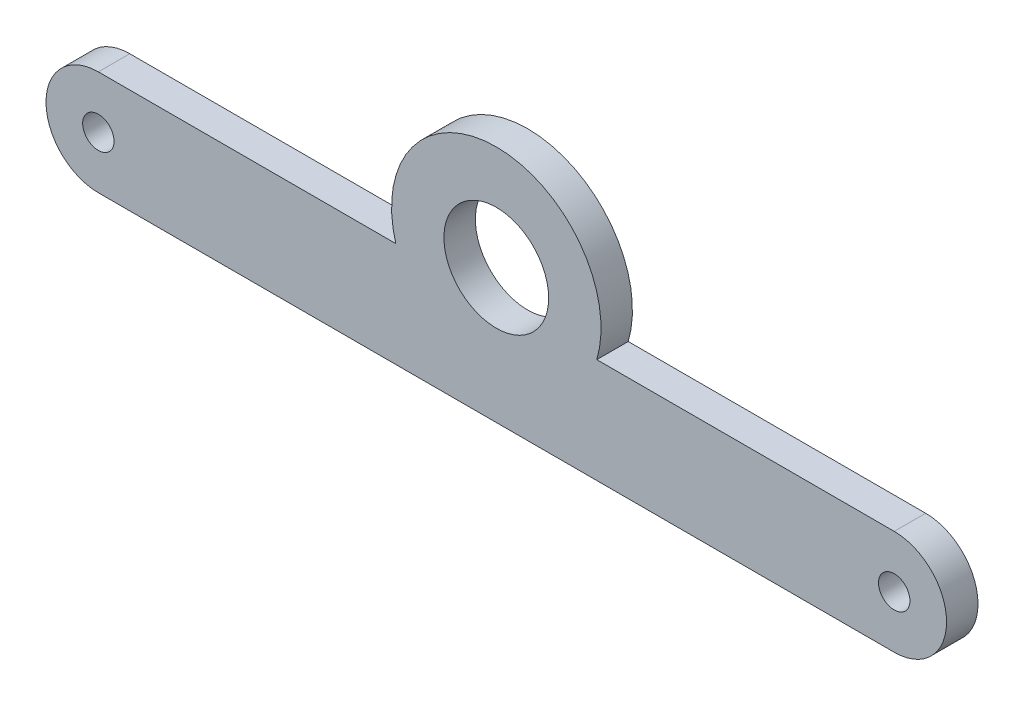
ISO-10303-21;
HEADER;
FILE_DESCRIPTION(('STEP AP214'),'2;1');
FILE_NAME('part.step','',(''),(''),'','','');
FILE_SCHEMA(('AUTOMOTIVE_DESIGN { 1 0 10303 214 1 1 1 1 }'));
ENDSEC;
DATA;
#1=APPLICATION_CONTEXT('core data for automotive mechanical design processes');
#2=APPLICATION_PROTOCOL_DEFINITION('international standard','automotive_design',2000,#1);
#3=PRODUCT_CONTEXT('',#1,'mechanical');
#4=PRODUCT('Part','Part','',(#3));
#5=PRODUCT_RELATED_PRODUCT_CATEGORY('part','',(#4));
#6=PRODUCT_DEFINITION_FORMATION('','',#4);
#7=PRODUCT_DEFINITION_CONTEXT('part definition',#1,'design');
#8=PRODUCT_DEFINITION('design','',#6,#7);
#9=PRODUCT_DEFINITION_SHAPE('','',#8);
#10=(LENGTH_UNIT() NAMED_UNIT(*) SI_UNIT(.MILLI.,.METRE.));
#11=(NAMED_UNIT(*) PLANE_ANGLE_UNIT() SI_UNIT($,.RADIAN.));
#12=(NAMED_UNIT(*) SI_UNIT($,.STERADIAN.) SOLID_ANGLE_UNIT());
#13=UNCERTAINTY_MEASURE_WITH_UNIT(LENGTH_MEASURE(1.E-05),#10,'distance_accuracy_value','');
#14=(GEOMETRIC_REPRESENTATION_CONTEXT(3) GLOBAL_UNCERTAINTY_ASSIGNED_CONTEXT((#13)) GLOBAL_UNIT_ASSIGNED_CONTEXT((#10,
#11,#12)) REPRESENTATION_CONTEXT('',''));
#15=CARTESIAN_POINT('',(0.,0.,0.));
#16=DIRECTION('',(0.,0.,1.));
#17=DIRECTION('',(1.,0.,0.));
#18=AXIS2_PLACEMENT_3D('',#15,#16,#17);
#19=CARTESIAN_POINT('',(-63.7279373587438,0.,3.));
#20=DIRECTION('',(0.,0.,1.));
#21=DIRECTION('',(1.,0.,0.));
#22=AXIS2_PLACEMENT_3D('',#19,#20,#21);
#23=PLANE('',#22);
#24=CARTESIAN_POINT('',(-63.7279373587438,0.,3.));
#25=DIRECTION('',(0.,0.,1.));
#26=DIRECTION('',(1.,0.,0.));
#27=AXIS2_PLACEMENT_3D('',#24,#25,#26);
#28=CIRCLE('',#27,1.5);
#29=CARTESIAN_POINT('',(-62.2279373587438,0.,3.));
#30=VERTEX_POINT('',#29);
#31=EDGE_CURVE('E188',#30,#30,#28,.T.);
#32=ORIENTED_EDGE('',*,*,#31,.F.);
#33=EDGE_LOOP('',(#32));
#34=FACE_BOUND('',#33,.T.);
#35=CARTESIAN_POINT('',(-63.7279373587438,0.,3.));
#36=DIRECTION('',(0.,0.,1.));
#37=DIRECTION('',(1.,0.,0.));
#38=AXIS2_PLACEMENT_3D('',#35,#36,#37);
#39=CIRCLE('',#38,5.);
#40=CARTESIAN_POINT('',(-63.7279373587438,5.,3.));
#41=VERTEX_POINT('',#40);
#42=CARTESIAN_POINT('',(-63.7279373587438,-5.,3.));
#43=VERTEX_POINT('',#42);
#44=EDGE_CURVE('E133',#41,#43,#39,.T.);
#45=ORIENTED_EDGE('',*,*,#44,.T.);
#46=DIRECTION('',(1.,0.,0.));
#47=VECTOR('',#46,1.);
#48=CARTESIAN_POINT('',(-63.7279373587438,-5.,3.));
#49=LINE('',#48,#47);
#50=CARTESIAN_POINT('',(12.2720626412562,-5.,3.));
#51=VERTEX_POINT('',#50);
#52=EDGE_CURVE('E91',#43,#51,#49,.T.);
#53=ORIENTED_EDGE('',*,*,#52,.T.);
#54=CARTESIAN_POINT('',(12.2720626412562,0.,3.));
#55=DIRECTION('',(0.,0.,1.));
#56=DIRECTION('',(1.,0.,0.));
#57=AXIS2_PLACEMENT_3D('',#54,#55,#56);
#58=CIRCLE('',#57,5.);
#59=CARTESIAN_POINT('',(12.2720626412562,5.,3.));
#60=VERTEX_POINT('',#59);
#61=EDGE_CURVE('E104',#51,#60,#58,.T.);
#62=ORIENTED_EDGE('',*,*,#61,.T.);
#63=DIRECTION('',(-1.,0.,0.));
#64=VECTOR('',#63,1.);
#65=CARTESIAN_POINT('',(12.2720626412562,5.,3.));
#66=LINE('',#65,#64);
#67=CARTESIAN_POINT('',(-16.1279373587438,5.,3.));
#68=VERTEX_POINT('',#67);
#69=EDGE_CURVE('E98',#60,#68,#66,.T.);
#70=ORIENTED_EDGE('',*,*,#69,.T.);
#71=CARTESIAN_POINT('',(-25.7279373587438,7.8,3.));
#72=DIRECTION('',(0.,0.,1.));
#73=DIRECTION('',(1.,0.,0.));
#74=AXIS2_PLACEMENT_3D('',#71,#72,#73);
#75=CIRCLE('',#74,10.);
#76=CARTESIAN_POINT('',(-35.3279373587438,5.,3.));
#77=VERTEX_POINT('',#76);
#78=EDGE_CURVE('E102',#68,#77,#75,.T.);
#79=ORIENTED_EDGE('',*,*,#78,.T.);
#80=DIRECTION('',(-1.,0.,0.));
#81=VECTOR('',#80,1.);
#82=CARTESIAN_POINT('',(-63.7279373587438,5.,3.));
#83=LINE('',#82,#81);
#84=EDGE_CURVE('E54',#77,#41,#83,.T.);
#85=ORIENTED_EDGE('',*,*,#84,.T.);
#86=EDGE_LOOP('',(#45,#53,#62,#70,#79,#85));
#87=FACE_BOUND('',#86,.T.);
#88=CARTESIAN_POINT('',(-25.7279373587438,7.8,3.));
#89=DIRECTION('',(0.,0.,1.));
#90=DIRECTION('',(1.,0.,0.));
#91=AXIS2_PLACEMENT_3D('',#88,#89,#90);
#92=CIRCLE('',#91,5.);
#93=CARTESIAN_POINT('',(-20.7279373587438,7.8,3.));
#94=VERTEX_POINT('',#93);
#95=EDGE_CURVE('E126',#94,#94,#92,.T.);
#96=ORIENTED_EDGE('',*,*,#95,.F.);
#97=EDGE_LOOP('',(#96));
#98=FACE_BOUND('',#97,.T.);
#99=CARTESIAN_POINT('',(12.2720626412562,0.,3.));
#100=DIRECTION('',(0.,0.,1.));
#101=DIRECTION('',(1.,0.,0.));
#102=AXIS2_PLACEMENT_3D('',#99,#100,#101);
#103=CIRCLE('',#102,1.5);
#104=CARTESIAN_POINT('',(13.7720626412562,0.,3.));
#105=VERTEX_POINT('',#104);
#106=EDGE_CURVE('E179',#105,#105,#103,.T.);
#107=ORIENTED_EDGE('',*,*,#106,.F.);
#108=EDGE_LOOP('',(#107));
#109=FACE_BOUND('',#108,.T.);
#110=ADVANCED_FACE('F37',(#34,#87,#98,#109),#23,.T.);
#111=CARTESIAN_POINT('',(-63.7279373587438,0.,0.));
#112=DIRECTION('',(0.,0.,1.));
#113=DIRECTION('',(1.,0.,0.));
#114=AXIS2_PLACEMENT_3D('',#111,#112,#113);
#115=PLANE('',#114);
#116=CARTESIAN_POINT('',(-63.7279373587438,0.,0.));
#117=DIRECTION('',(0.,0.,1.));
#118=DIRECTION('',(1.,0.,0.));
#119=AXIS2_PLACEMENT_3D('',#116,#117,#118);
#120=CIRCLE('',#119,5.);
#121=CARTESIAN_POINT('',(-63.7279373587438,5.,0.));
#122=VERTEX_POINT('',#121);
#123=CARTESIAN_POINT('',(-63.7279373587438,-5.,0.));
#124=VERTEX_POINT('',#123);
#125=EDGE_CURVE('E122',#122,#124,#120,.T.);
#126=ORIENTED_EDGE('',*,*,#125,.F.);
#127=DIRECTION('',(-1.,0.,0.));
#128=VECTOR('',#127,1.);
#129=CARTESIAN_POINT('',(-63.7279373587438,5.,0.));
#130=LINE('',#129,#128);
#131=CARTESIAN_POINT('',(-35.3279373587438,5.,0.));
#132=VERTEX_POINT('',#131);
#133=EDGE_CURVE('E83',#132,#122,#130,.T.);
#134=ORIENTED_EDGE('',*,*,#133,.F.);
#135=CARTESIAN_POINT('',(-25.7279373587438,7.8,0.));
#136=DIRECTION('',(0.,0.,1.));
#137=DIRECTION('',(1.,0.,0.));
#138=AXIS2_PLACEMENT_3D('',#135,#136,#137);
#139=CIRCLE('',#138,10.);
#140=CARTESIAN_POINT('',(-16.1279373587438,5.,0.));
#141=VERTEX_POINT('',#140);
#142=EDGE_CURVE('E77',#141,#132,#139,.T.);
#143=ORIENTED_EDGE('',*,*,#142,.F.);
#144=DIRECTION('',(-1.,0.,0.));
#145=VECTOR('',#144,1.);
#146=CARTESIAN_POINT('',(12.2720626412562,5.,0.));
#147=LINE('',#146,#145);
#148=CARTESIAN_POINT('',(12.2720626412562,5.,0.));
#149=VERTEX_POINT('',#148);
#150=EDGE_CURVE('E112',#149,#141,#147,.T.);
#151=ORIENTED_EDGE('',*,*,#150,.F.);
#152=CARTESIAN_POINT('',(12.2720626412562,0.,0.));
#153=DIRECTION('',(0.,0.,1.));
#154=DIRECTION('',(1.,0.,0.));
#155=AXIS2_PLACEMENT_3D('',#152,#153,#154);
#156=CIRCLE('',#155,5.);
#157=CARTESIAN_POINT('',(12.2720626412562,-5.,0.));
#158=VERTEX_POINT('',#157);
#159=EDGE_CURVE('E128',#158,#149,#156,.T.);
#160=ORIENTED_EDGE('',*,*,#159,.F.);
#161=DIRECTION('',(1.,0.,0.));
#162=VECTOR('',#161,1.);
#163=CARTESIAN_POINT('',(-63.7279373587438,-5.,0.));
#164=LINE('',#163,#162);
#165=EDGE_CURVE('E125',#124,#158,#164,.T.);
#166=ORIENTED_EDGE('',*,*,#165,.F.);
#167=EDGE_LOOP('',(#126,#134,#143,#151,#160,#166));
#168=FACE_BOUND('',#167,.T.);
#169=CARTESIAN_POINT('',(-25.7279373587438,7.8,0.));
#170=DIRECTION('',(0.,0.,1.));
#171=DIRECTION('',(1.,0.,0.));
#172=AXIS2_PLACEMENT_3D('',#169,#170,#171);
#173=CIRCLE('',#172,5.);
#174=CARTESIAN_POINT('',(-20.7279373587438,7.8,0.));
#175=VERTEX_POINT('',#174);
#176=EDGE_CURVE('E191',#175,#175,#173,.T.);
#177=ORIENTED_EDGE('',*,*,#176,.T.);
#178=EDGE_LOOP('',(#177));
#179=FACE_BOUND('',#178,.T.);
#180=CARTESIAN_POINT('',(-63.7279373587438,0.,0.));
#181=DIRECTION('',(0.,0.,1.));
#182=DIRECTION('',(1.,0.,0.));
#183=AXIS2_PLACEMENT_3D('',#180,#181,#182);
#184=CIRCLE('',#183,1.5);
#185=CARTESIAN_POINT('',(-62.2279373587438,0.,0.));
#186=VERTEX_POINT('',#185);
#187=EDGE_CURVE('E185',#186,#186,#184,.T.);
#188=ORIENTED_EDGE('',*,*,#187,.T.);
#189=EDGE_LOOP('',(#188));
#190=FACE_BOUND('',#189,.T.);
#191=CARTESIAN_POINT('',(12.2720626412562,0.,0.));
#192=DIRECTION('',(0.,0.,1.));
#193=DIRECTION('',(1.,0.,0.));
#194=AXIS2_PLACEMENT_3D('',#191,#192,#193);
#195=CIRCLE('',#194,1.5);
#196=CARTESIAN_POINT('',(13.7720626412562,0.,0.));
#197=VERTEX_POINT('',#196);
#198=EDGE_CURVE('E182',#197,#197,#195,.T.);
#199=ORIENTED_EDGE('',*,*,#198,.T.);
#200=EDGE_LOOP('',(#199));
#201=FACE_BOUND('',#200,.T.);
#202=ADVANCED_FACE('F142',(#168,#179,#190,#201),#115,.F.);
#203=CARTESIAN_POINT('',(-63.7279373587438,0.,3.));
#204=DIRECTION('',(0.,0.,-1.));
#205=DIRECTION('',(-1.,0.,0.));
#206=AXIS2_PLACEMENT_3D('',#203,#204,#205);
#207=CYLINDRICAL_SURFACE('',#206,5.);
#208=ORIENTED_EDGE('',*,*,#125,.T.);
#209=DIRECTION('',(0.,0.,-1.));
#210=VECTOR('',#209,1.);
#211=CARTESIAN_POINT('',(-63.7279373587438,-5.,3.));
#212=LINE('',#211,#210);
#213=EDGE_CURVE('E11',#43,#124,#212,.T.);
#214=ORIENTED_EDGE('',*,*,#213,.F.);
#215=ORIENTED_EDGE('',*,*,#44,.F.);
#216=DIRECTION('',(0.,0.,-1.));
#217=VECTOR('',#216,1.);
#218=CARTESIAN_POINT('',(-63.7279373587438,5.,3.));
#219=LINE('',#218,#217);
#220=EDGE_CURVE('E118',#41,#122,#219,.T.);
#221=ORIENTED_EDGE('',*,*,#220,.T.);
#222=EDGE_LOOP('',(#208,#214,#215,#221));
#223=FACE_BOUND('',#222,.T.);
#224=ADVANCED_FACE('F39',(#223),#207,.T.);
#225=CARTESIAN_POINT('',(-63.7279373587438,-5.,3.));
#226=DIRECTION('',(0.,1.,0.));
#227=DIRECTION('',(-1.,0.,0.));
#228=AXIS2_PLACEMENT_3D('',#225,#226,#227);
#229=PLANE('',#228);
#230=ORIENTED_EDGE('',*,*,#165,.T.);
#231=DIRECTION('',(0.,0.,-1.));
#232=VECTOR('',#231,1.);
#233=CARTESIAN_POINT('',(12.2720626412562,-5.,3.));
#234=LINE('',#233,#232);
#235=EDGE_CURVE('E46',#51,#158,#234,.T.);
#236=ORIENTED_EDGE('',*,*,#235,.F.);
#237=ORIENTED_EDGE('',*,*,#52,.F.);
#238=ORIENTED_EDGE('',*,*,#213,.T.);
#239=EDGE_LOOP('',(#230,#236,#237,#238));
#240=FACE_BOUND('',#239,.T.);
#241=ADVANCED_FACE('F245',(#240),#229,.F.);
#242=CARTESIAN_POINT('',(12.2720626412562,0.,3.));
#243=DIRECTION('',(0.,0.,-1.));
#244=DIRECTION('',(-1.,0.,0.));
#245=AXIS2_PLACEMENT_3D('',#242,#243,#244);
#246=CYLINDRICAL_SURFACE('',#245,5.);
#247=ORIENTED_EDGE('',*,*,#159,.T.);
#248=DIRECTION('',(0.,0.,-1.));
#249=VECTOR('',#248,1.);
#250=CARTESIAN_POINT('',(12.2720626412562,5.,3.));
#251=LINE('',#250,#249);
#252=EDGE_CURVE('E113',#60,#149,#251,.T.);
#253=ORIENTED_EDGE('',*,*,#252,.F.);
#254=ORIENTED_EDGE('',*,*,#61,.F.);
#255=ORIENTED_EDGE('',*,*,#235,.T.);
#256=EDGE_LOOP('',(#247,#253,#254,#255));
#257=FACE_BOUND('',#256,.T.);
#258=ADVANCED_FACE('F139',(#257),#246,.T.);
#259=CARTESIAN_POINT('',(12.2720626412562,5.,3.));
#260=DIRECTION('',(0.,-1.,0.));
#261=DIRECTION('',(1.,0.,0.));
#262=AXIS2_PLACEMENT_3D('',#259,#260,#261);
#263=PLANE('',#262);
#264=ORIENTED_EDGE('',*,*,#150,.T.);
#265=DIRECTION('',(0.,0.,-1.));
#266=VECTOR('',#265,1.);
#267=CARTESIAN_POINT('',(-16.1279373587438,5.,3.));
#268=LINE('',#267,#266);
#269=EDGE_CURVE('E109',#68,#141,#268,.T.);
#270=ORIENTED_EDGE('',*,*,#269,.F.);
#271=ORIENTED_EDGE('',*,*,#69,.F.);
#272=ORIENTED_EDGE('',*,*,#252,.T.);
#273=EDGE_LOOP('',(#264,#270,#271,#272));
#274=FACE_BOUND('',#273,.T.);
#275=ADVANCED_FACE('F110',(#274),#263,.F.);
#276=CARTESIAN_POINT('',(-25.7279373587438,7.8,3.));
#277=DIRECTION('',(0.,0.,-1.));
#278=DIRECTION('',(-1.,0.,0.));
#279=AXIS2_PLACEMENT_3D('',#276,#277,#278);
#280=CYLINDRICAL_SURFACE('',#279,10.);
#281=ORIENTED_EDGE('',*,*,#142,.T.);
#282=DIRECTION('',(0.,0.,-1.));
#283=VECTOR('',#282,1.);
#284=CARTESIAN_POINT('',(-35.3279373587438,5.,3.));
#285=LINE('',#284,#283);
#286=EDGE_CURVE('E114',#77,#132,#285,.T.);
#287=ORIENTED_EDGE('',*,*,#286,.F.);
#288=ORIENTED_EDGE('',*,*,#78,.F.);
#289=ORIENTED_EDGE('',*,*,#269,.T.);
#290=EDGE_LOOP('',(#281,#287,#288,#289));
#291=FACE_BOUND('',#290,.T.);
#292=ADVANCED_FACE('F116',(#291),#280,.T.);
#293=CARTESIAN_POINT('',(-63.7279373587438,5.,3.));
#294=DIRECTION('',(0.,-1.,0.));
#295=DIRECTION('',(0.,0.,-1.));
#296=AXIS2_PLACEMENT_3D('',#293,#294,#295);
#297=PLANE('',#296);
#298=ORIENTED_EDGE('',*,*,#133,.T.);
#299=ORIENTED_EDGE('',*,*,#220,.F.);
#300=ORIENTED_EDGE('',*,*,#84,.F.);
#301=ORIENTED_EDGE('',*,*,#286,.T.);
#302=EDGE_LOOP('',(#298,#299,#300,#301));
#303=FACE_BOUND('',#302,.T.);
#304=ADVANCED_FACE('F147',(#303),#297,.F.);
#305=CARTESIAN_POINT('',(-25.7279373587438,7.8,3.));
#306=DIRECTION('',(0.,0.,-1.));
#307=DIRECTION('',(-1.,0.,0.));
#308=AXIS2_PLACEMENT_3D('',#305,#306,#307);
#309=CYLINDRICAL_SURFACE('',#308,5.);
#310=ORIENTED_EDGE('',*,*,#95,.T.);
#311=EDGE_LOOP('',(#310));
#312=FACE_BOUND('',#311,.T.);
#313=ORIENTED_EDGE('',*,*,#176,.F.);
#314=EDGE_LOOP('',(#313));
#315=FACE_BOUND('',#314,.T.);
#316=ADVANCED_FACE('F149',(#312,#315),#309,.F.);
#317=CARTESIAN_POINT('',(-63.7279373587438,0.,3.));
#318=DIRECTION('',(0.,0.,-1.));
#319=DIRECTION('',(-1.,0.,0.));
#320=AXIS2_PLACEMENT_3D('',#317,#318,#319);
#321=CYLINDRICAL_SURFACE('',#320,1.5);
#322=ORIENTED_EDGE('',*,*,#31,.T.);
#323=EDGE_LOOP('',(#322));
#324=FACE_BOUND('',#323,.T.);
#325=ORIENTED_EDGE('',*,*,#187,.F.);
#326=EDGE_LOOP('',(#325));
#327=FACE_BOUND('',#326,.T.);
#328=ADVANCED_FACE('F155',(#324,#327),#321,.F.);
#329=CARTESIAN_POINT('',(12.2720626412562,0.,3.));
#330=DIRECTION('',(0.,0.,-1.));
#331=DIRECTION('',(-1.,0.,0.));
#332=AXIS2_PLACEMENT_3D('',#329,#330,#331);
#333=CYLINDRICAL_SURFACE('',#332,1.5);
#334=ORIENTED_EDGE('',*,*,#106,.T.);
#335=EDGE_LOOP('',(#334));
#336=FACE_BOUND('',#335,.T.);
#337=ORIENTED_EDGE('',*,*,#198,.F.);
#338=EDGE_LOOP('',(#337));
#339=FACE_BOUND('',#338,.T.);
#340=ADVANCED_FACE('F170',(#336,#339),#333,.F.);
#341=CLOSED_SHELL('',(#110,#202,#224,#241,#258,#275,#292,#304,#316,#328,#340));
#342=MANIFOLD_SOLID_BREP('B2',#341);
#343=ADVANCED_BREP_SHAPE_REPRESENTATION('',(#18,#342),#14);
#344=SHAPE_DEFINITION_REPRESENTATION(#9,#343);
ENDSEC;
END-ISO-10303-21;
